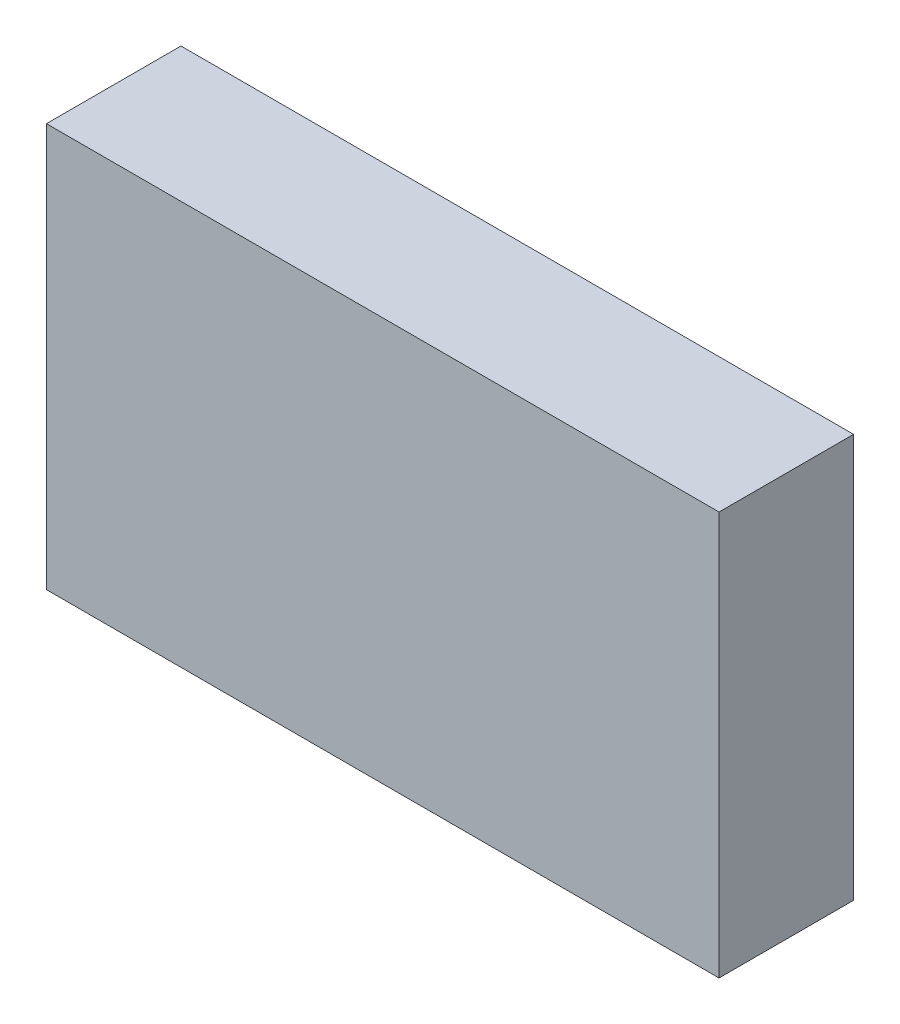
ISO-10303-21;
HEADER;
FILE_DESCRIPTION(('STEP AP214'),'2;1');
FILE_NAME('part.step','',(''),(''),'','','');
FILE_SCHEMA(('AUTOMOTIVE_DESIGN { 1 0 10303 214 1 1 1 1 }'));
ENDSEC;
DATA;
#1=APPLICATION_CONTEXT('core data for automotive mechanical design processes');
#2=APPLICATION_PROTOCOL_DEFINITION('international standard','automotive_design',2000,#1);
#3=PRODUCT_CONTEXT('',#1,'mechanical');
#4=PRODUCT('Part','Part','',(#3));
#5=PRODUCT_RELATED_PRODUCT_CATEGORY('part','',(#4));
#6=PRODUCT_DEFINITION_FORMATION('','',#4);
#7=PRODUCT_DEFINITION_CONTEXT('part definition',#1,'design');
#8=PRODUCT_DEFINITION('design','',#6,#7);
#9=PRODUCT_DEFINITION_SHAPE('','',#8);
#10=(LENGTH_UNIT() NAMED_UNIT(*) SI_UNIT(.MILLI.,.METRE.));
#11=(NAMED_UNIT(*) PLANE_ANGLE_UNIT() SI_UNIT($,.RADIAN.));
#12=(NAMED_UNIT(*) SI_UNIT($,.STERADIAN.) SOLID_ANGLE_UNIT());
#13=UNCERTAINTY_MEASURE_WITH_UNIT(LENGTH_MEASURE(1.E-05),#10,'distance_accuracy_value','');
#14=(GEOMETRIC_REPRESENTATION_CONTEXT(3) GLOBAL_UNCERTAINTY_ASSIGNED_CONTEXT((#13)) GLOBAL_UNIT_ASSIGNED_CONTEXT((#10,
#11,#12)) REPRESENTATION_CONTEXT('',''));
#15=CARTESIAN_POINT('',(0.,0.,0.));
#16=DIRECTION('',(0.,0.,1.));
#17=DIRECTION('',(1.,0.,0.));
#18=AXIS2_PLACEMENT_3D('',#15,#16,#17);
#19=CARTESIAN_POINT('',(2.5,1.5,1.));
#20=DIRECTION('',(-1.,0.,0.));
#21=DIRECTION('',(0.,0.,1.));
#22=AXIS2_PLACEMENT_3D('',#19,#20,#21);
#23=PLANE('',#22);
#24=DIRECTION('',(0.,1.,0.));
#25=VECTOR('',#24,1.);
#26=CARTESIAN_POINT('',(2.5,1.5,0.));
#27=LINE('',#26,#25);
#28=CARTESIAN_POINT('',(2.5,-1.5,0.));
#29=VERTEX_POINT('',#28);
#30=CARTESIAN_POINT('',(2.5,1.5,0.));
#31=VERTEX_POINT('',#30);
#32=EDGE_CURVE('E100',#29,#31,#27,.T.);
#33=ORIENTED_EDGE('',*,*,#32,.T.);
#34=DIRECTION('',(0.,0.,-1.));
#35=VECTOR('',#34,1.);
#36=CARTESIAN_POINT('',(2.5,1.5,1.));
#37=LINE('',#36,#35);
#38=CARTESIAN_POINT('',(2.5,1.5,1.));
#39=VERTEX_POINT('',#38);
#40=EDGE_CURVE('E11',#39,#31,#37,.T.);
#41=ORIENTED_EDGE('',*,*,#40,.F.);
#42=DIRECTION('',(0.,1.,0.));
#43=VECTOR('',#42,1.);
#44=CARTESIAN_POINT('',(2.5,1.5,1.));
#45=LINE('',#44,#43);
#46=CARTESIAN_POINT('',(2.5,-1.5,1.));
#47=VERTEX_POINT('',#46);
#48=EDGE_CURVE('E88',#47,#39,#45,.T.);
#49=ORIENTED_EDGE('',*,*,#48,.F.);
#50=DIRECTION('',(0.,0.,-1.));
#51=VECTOR('',#50,1.);
#52=CARTESIAN_POINT('',(2.5,-1.5,1.));
#53=LINE('',#52,#51);
#54=EDGE_CURVE('E96',#47,#29,#53,.T.);
#55=ORIENTED_EDGE('',*,*,#54,.T.);
#56=EDGE_LOOP('',(#33,#41,#49,#55));
#57=FACE_BOUND('',#56,.T.);
#58=ADVANCED_FACE('F37',(#57),#23,.F.);
#59=CARTESIAN_POINT('',(-2.5,1.5,1.));
#60=DIRECTION('',(0.,-1.,0.));
#61=DIRECTION('',(0.,0.,-1.));
#62=AXIS2_PLACEMENT_3D('',#59,#60,#61);
#63=PLANE('',#62);
#64=DIRECTION('',(-1.,0.,0.));
#65=VECTOR('',#64,1.);
#66=CARTESIAN_POINT('',(-2.5,1.5,0.));
#67=LINE('',#66,#65);
#68=CARTESIAN_POINT('',(-2.5,1.5,0.));
#69=VERTEX_POINT('',#68);
#70=EDGE_CURVE('E92',#31,#69,#67,.T.);
#71=ORIENTED_EDGE('',*,*,#70,.T.);
#72=DIRECTION('',(0.,0.,-1.));
#73=VECTOR('',#72,1.);
#74=CARTESIAN_POINT('',(-2.5,1.5,1.));
#75=LINE('',#74,#73);
#76=CARTESIAN_POINT('',(-2.5,1.5,1.));
#77=VERTEX_POINT('',#76);
#78=EDGE_CURVE('E45',#77,#69,#75,.T.);
#79=ORIENTED_EDGE('',*,*,#78,.F.);
#80=DIRECTION('',(-1.,0.,0.));
#81=VECTOR('',#80,1.);
#82=CARTESIAN_POINT('',(-2.5,1.5,1.));
#83=LINE('',#82,#81);
#84=EDGE_CURVE('E83',#39,#77,#83,.T.);
#85=ORIENTED_EDGE('',*,*,#84,.F.);
#86=ORIENTED_EDGE('',*,*,#40,.T.);
#87=EDGE_LOOP('',(#71,#79,#85,#86));
#88=FACE_BOUND('',#87,.T.);
#89=ADVANCED_FACE('F91',(#88),#63,.F.);
#90=CARTESIAN_POINT('',(-2.5,1.5,1.));
#91=DIRECTION('',(1.,0.,0.));
#92=DIRECTION('',(0.,0.,-1.));
#93=AXIS2_PLACEMENT_3D('',#90,#91,#92);
#94=PLANE('',#93);
#95=DIRECTION('',(0.,-1.,0.));
#96=VECTOR('',#95,1.);
#97=CARTESIAN_POINT('',(-2.5,1.5,0.));
#98=LINE('',#97,#96);
#99=CARTESIAN_POINT('',(-2.5,-1.5,0.));
#100=VERTEX_POINT('',#99);
#101=EDGE_CURVE('E70',#69,#100,#98,.T.);
#102=ORIENTED_EDGE('',*,*,#101,.T.);
#103=DIRECTION('',(0.,0.,-1.));
#104=VECTOR('',#103,1.);
#105=CARTESIAN_POINT('',(-2.5,-1.5,1.));
#106=LINE('',#105,#104);
#107=CARTESIAN_POINT('',(-2.5,-1.5,1.));
#108=VERTEX_POINT('',#107);
#109=EDGE_CURVE('E93',#108,#100,#106,.T.);
#110=ORIENTED_EDGE('',*,*,#109,.F.);
#111=DIRECTION('',(0.,-1.,0.));
#112=VECTOR('',#111,1.);
#113=CARTESIAN_POINT('',(-2.5,1.5,1.));
#114=LINE('',#113,#112);
#115=EDGE_CURVE('E86',#77,#108,#114,.T.);
#116=ORIENTED_EDGE('',*,*,#115,.F.);
#117=ORIENTED_EDGE('',*,*,#78,.T.);
#118=EDGE_LOOP('',(#102,#110,#116,#117));
#119=FACE_BOUND('',#118,.T.);
#120=ADVANCED_FACE('F94',(#119),#94,.F.);
#121=CARTESIAN_POINT('',(-2.5,-1.5,1.));
#122=DIRECTION('',(0.,1.,0.));
#123=DIRECTION('',(0.,0.,1.));
#124=AXIS2_PLACEMENT_3D('',#121,#122,#123);
#125=PLANE('',#124);
#126=DIRECTION('',(1.,0.,0.));
#127=VECTOR('',#126,1.);
#128=CARTESIAN_POINT('',(-2.5,-1.5,0.));
#129=LINE('',#128,#127);
#130=EDGE_CURVE('E76',#100,#29,#129,.T.);
#131=ORIENTED_EDGE('',*,*,#130,.T.);
#132=ORIENTED_EDGE('',*,*,#54,.F.);
#133=DIRECTION('',(1.,0.,0.));
#134=VECTOR('',#133,1.);
#135=CARTESIAN_POINT('',(-2.5,-1.5,1.));
#136=LINE('',#135,#134);
#137=EDGE_CURVE('E53',#108,#47,#136,.T.);
#138=ORIENTED_EDGE('',*,*,#137,.F.);
#139=ORIENTED_EDGE('',*,*,#109,.T.);
#140=EDGE_LOOP('',(#131,#132,#138,#139));
#141=FACE_BOUND('',#140,.T.);
#142=ADVANCED_FACE('F107',(#141),#125,.F.);
#143=CARTESIAN_POINT('',(0.,0.,1.));
#144=DIRECTION('',(0.,0.,1.));
#145=DIRECTION('',(1.,0.,0.));
#146=AXIS2_PLACEMENT_3D('',#143,#144,#145);
#147=PLANE('',#146);
#148=ORIENTED_EDGE('',*,*,#48,.T.);
#149=ORIENTED_EDGE('',*,*,#84,.T.);
#150=ORIENTED_EDGE('',*,*,#115,.T.);
#151=ORIENTED_EDGE('',*,*,#137,.T.);
#152=EDGE_LOOP('',(#148,#149,#150,#151));
#153=FACE_BOUND('',#152,.T.);
#154=ADVANCED_FACE('F84',(#153),#147,.T.);
#155=CARTESIAN_POINT('',(0.,0.,0.));
#156=DIRECTION('',(0.,0.,1.));
#157=DIRECTION('',(1.,0.,0.));
#158=AXIS2_PLACEMENT_3D('',#155,#156,#157);
#159=PLANE('',#158);
#160=ORIENTED_EDGE('',*,*,#32,.F.);
#161=ORIENTED_EDGE('',*,*,#130,.F.);
#162=ORIENTED_EDGE('',*,*,#101,.F.);
#163=ORIENTED_EDGE('',*,*,#70,.F.);
#164=EDGE_LOOP('',(#160,#161,#162,#163));
#165=FACE_BOUND('',#164,.T.);
#166=ADVANCED_FACE('F110',(#165),#159,.F.);
#167=CLOSED_SHELL('',(#58,#89,#120,#142,#154,#166));
#168=MANIFOLD_SOLID_BREP('B2',#167);
#169=ADVANCED_BREP_SHAPE_REPRESENTATION('',(#18,#168),#14);
#170=SHAPE_DEFINITION_REPRESENTATION(#9,#169);
ENDSEC;
END-ISO-10303-21;
